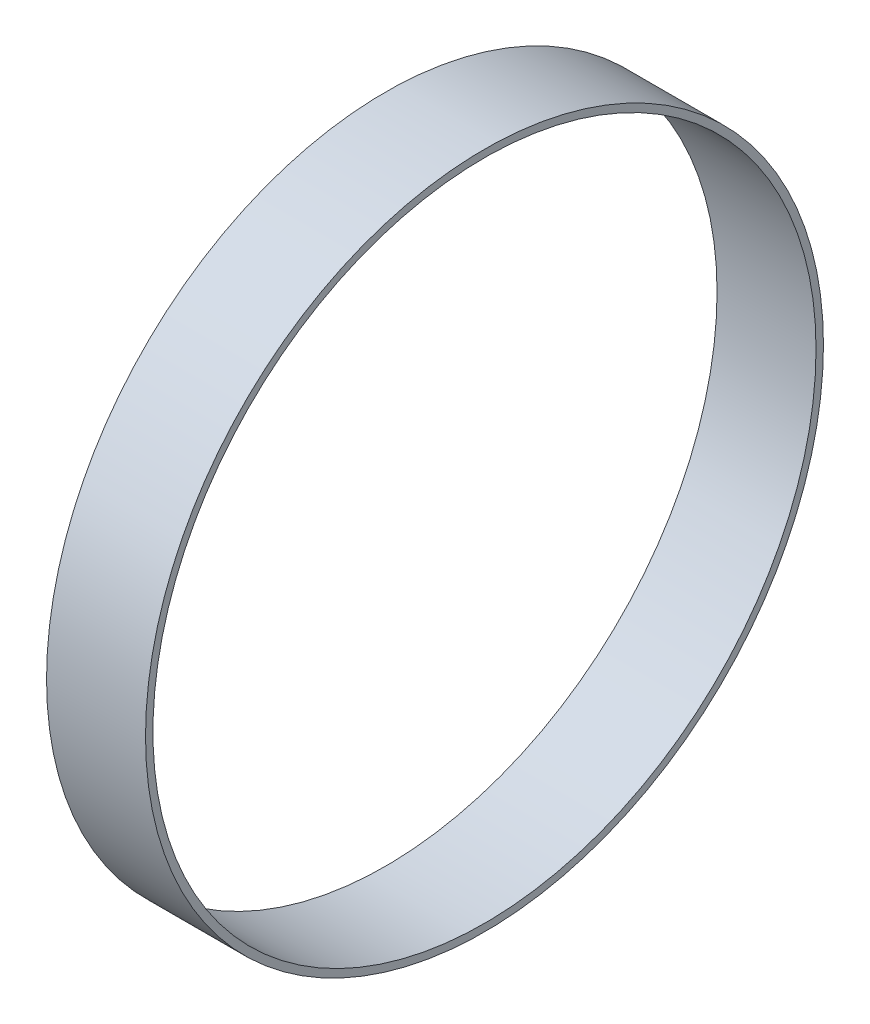
ISO-10303-21;
HEADER;
FILE_DESCRIPTION(('STEP AP214'),'2;1');
FILE_NAME('part.step','',(''),(''),'','','');
FILE_SCHEMA(('AUTOMOTIVE_DESIGN { 1 0 10303 214 1 1 1 1 }'));
ENDSEC;
DATA;
#1=APPLICATION_CONTEXT('core data for automotive mechanical design processes');
#2=APPLICATION_PROTOCOL_DEFINITION('international standard','automotive_design',2000,#1);
#3=PRODUCT_CONTEXT('',#1,'mechanical');
#4=PRODUCT('Part','Part','',(#3));
#5=PRODUCT_RELATED_PRODUCT_CATEGORY('part','',(#4));
#6=PRODUCT_DEFINITION_FORMATION('','',#4);
#7=PRODUCT_DEFINITION_CONTEXT('part definition',#1,'design');
#8=PRODUCT_DEFINITION('design','',#6,#7);
#9=PRODUCT_DEFINITION_SHAPE('','',#8);
#10=(LENGTH_UNIT() NAMED_UNIT(*) SI_UNIT(.MILLI.,.METRE.));
#11=(NAMED_UNIT(*) PLANE_ANGLE_UNIT() SI_UNIT($,.RADIAN.));
#12=(NAMED_UNIT(*) SI_UNIT($,.STERADIAN.) SOLID_ANGLE_UNIT());
#13=UNCERTAINTY_MEASURE_WITH_UNIT(LENGTH_MEASURE(1.E-05),#10,'distance_accuracy_value','');
#14=(GEOMETRIC_REPRESENTATION_CONTEXT(3) GLOBAL_UNCERTAINTY_ASSIGNED_CONTEXT((#13)) GLOBAL_UNIT_ASSIGNED_CONTEXT((#10,
#11,#12)) REPRESENTATION_CONTEXT('',''));
#15=CARTESIAN_POINT('',(0.,0.,0.));
#16=DIRECTION('',(0.,0.,1.));
#17=DIRECTION('',(1.,0.,0.));
#18=AXIS2_PLACEMENT_3D('',#15,#16,#17);
#19=CARTESIAN_POINT('',(25.4,0.,0.));
#20=DIRECTION('',(1.,0.,0.));
#21=DIRECTION('',(0.,0.,-1.));
#22=AXIS2_PLACEMENT_3D('',#19,#20,#21);
#23=PLANE('',#22);
#24=CARTESIAN_POINT('',(25.4,0.,0.));
#25=DIRECTION('',(1.,0.,0.));
#26=DIRECTION('',(0.,0.,-1.));
#27=AXIS2_PLACEMENT_3D('',#24,#25,#26);
#28=CIRCLE('',#27,86.995);
#29=CARTESIAN_POINT('',(25.4,0.,-86.995));
#30=VERTEX_POINT('',#29);
#31=EDGE_CURVE('E10',#30,#30,#28,.T.);
#32=ORIENTED_EDGE('',*,*,#31,.T.);
#33=EDGE_LOOP('',(#32));
#34=FACE_BOUND('',#33,.T.);
#35=CARTESIAN_POINT('',(25.4,0.,0.));
#36=DIRECTION('',(1.,0.,0.));
#37=DIRECTION('',(0.,0.,-1.));
#38=AXIS2_PLACEMENT_3D('',#35,#36,#37);
#39=CIRCLE('',#38,85.09);
#40=CARTESIAN_POINT('',(25.4,0.,-85.09));
#41=VERTEX_POINT('',#40);
#42=EDGE_CURVE('E51',#41,#41,#39,.T.);
#43=ORIENTED_EDGE('',*,*,#42,.F.);
#44=EDGE_LOOP('',(#43));
#45=FACE_BOUND('',#44,.T.);
#46=ADVANCED_FACE('F40',(#34,#45),#23,.T.);
#47=CARTESIAN_POINT('',(0.,0.,0.));
#48=DIRECTION('',(1.,0.,0.));
#49=DIRECTION('',(0.,0.,-1.));
#50=AXIS2_PLACEMENT_3D('',#47,#48,#49);
#51=PLANE('',#50);
#52=CARTESIAN_POINT('',(0.,0.,0.));
#53=DIRECTION('',(1.,0.,0.));
#54=DIRECTION('',(0.,0.,-1.));
#55=AXIS2_PLACEMENT_3D('',#52,#53,#54);
#56=CIRCLE('',#55,86.995);
#57=CARTESIAN_POINT('',(0.,0.,-86.995));
#58=VERTEX_POINT('',#57);
#59=EDGE_CURVE('E44',#58,#58,#56,.T.);
#60=ORIENTED_EDGE('',*,*,#59,.F.);
#61=EDGE_LOOP('',(#60));
#62=FACE_BOUND('',#61,.T.);
#63=CARTESIAN_POINT('',(0.,0.,0.));
#64=DIRECTION('',(1.,0.,0.));
#65=DIRECTION('',(0.,0.,-1.));
#66=AXIS2_PLACEMENT_3D('',#63,#64,#65);
#67=CIRCLE('',#66,85.09);
#68=CARTESIAN_POINT('',(0.,0.,-85.09));
#69=VERTEX_POINT('',#68);
#70=EDGE_CURVE('E53',#69,#69,#67,.T.);
#71=ORIENTED_EDGE('',*,*,#70,.T.);
#72=EDGE_LOOP('',(#71));
#73=FACE_BOUND('',#72,.T.);
#74=ADVANCED_FACE('F63',(#62,#73),#51,.F.);
#75=CARTESIAN_POINT('',(25.4,0.,0.));
#76=DIRECTION('',(-1.,0.,0.));
#77=DIRECTION('',(0.,0.,1.));
#78=AXIS2_PLACEMENT_3D('',#75,#76,#77);
#79=CYLINDRICAL_SURFACE('',#78,86.995);
#80=ORIENTED_EDGE('',*,*,#31,.F.);
#81=EDGE_LOOP('',(#80));
#82=FACE_BOUND('',#81,.T.);
#83=ORIENTED_EDGE('',*,*,#59,.T.);
#84=EDGE_LOOP('',(#83));
#85=FACE_BOUND('',#84,.T.);
#86=ADVANCED_FACE('F42',(#82,#85),#79,.T.);
#87=CARTESIAN_POINT('',(25.4,0.,0.));
#88=DIRECTION('',(-1.,0.,0.));
#89=DIRECTION('',(0.,0.,1.));
#90=AXIS2_PLACEMENT_3D('',#87,#88,#89);
#91=CYLINDRICAL_SURFACE('',#90,85.09);
#92=ORIENTED_EDGE('',*,*,#42,.T.);
#93=EDGE_LOOP('',(#92));
#94=FACE_BOUND('',#93,.T.);
#95=ORIENTED_EDGE('',*,*,#70,.F.);
#96=EDGE_LOOP('',(#95));
#97=FACE_BOUND('',#96,.T.);
#98=ADVANCED_FACE('F59',(#94,#97),#91,.F.);
#99=CLOSED_SHELL('',(#46,#74,#86,#98));
#100=MANIFOLD_SOLID_BREP('B2',#99);
#101=ADVANCED_BREP_SHAPE_REPRESENTATION('',(#18,#100),#14);
#102=SHAPE_DEFINITION_REPRESENTATION(#9,#101);
ENDSEC;
END-ISO-10303-21;
